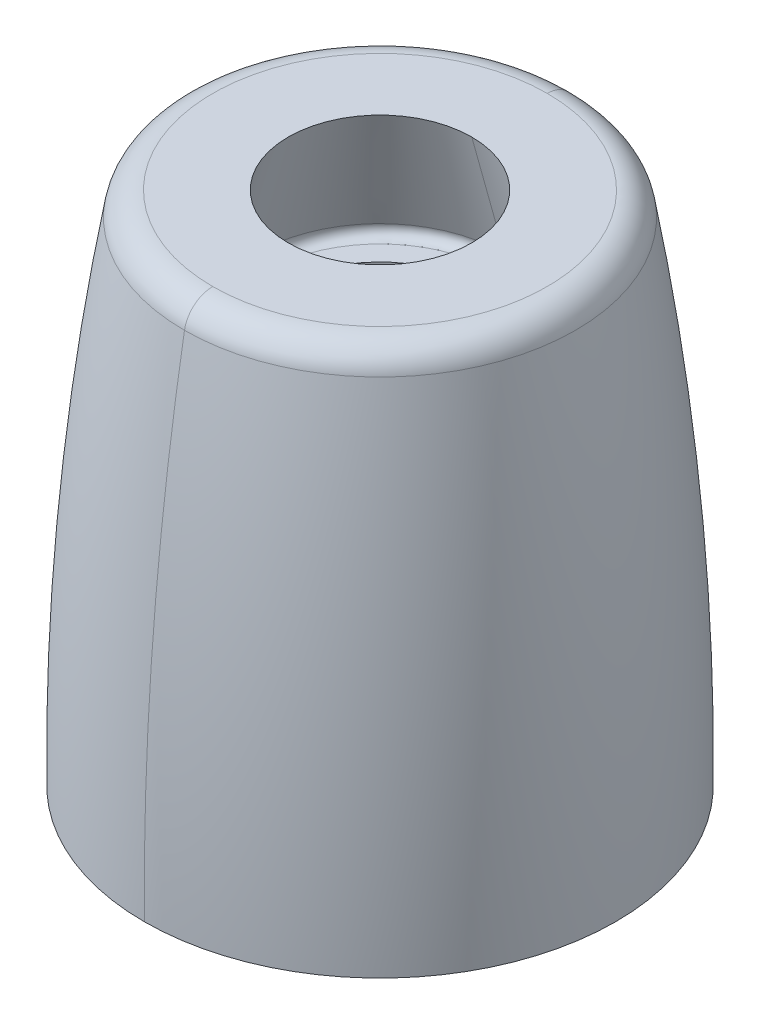
ISO-10303-21;
HEADER;
FILE_DESCRIPTION(('STEP AP214'),'2;1');
FILE_NAME('part.step','',(''),(''),'','','');
FILE_SCHEMA(('AUTOMOTIVE_DESIGN { 1 0 10303 214 1 1 1 1 }'));
ENDSEC;
DATA;
#1=APPLICATION_CONTEXT('core data for automotive mechanical design processes');
#2=APPLICATION_PROTOCOL_DEFINITION('international standard','automotive_design',2000,#1);
#3=PRODUCT_CONTEXT('',#1,'mechanical');
#4=PRODUCT('Part','Part','',(#3));
#5=PRODUCT_RELATED_PRODUCT_CATEGORY('part','',(#4));
#6=PRODUCT_DEFINITION_FORMATION('','',#4);
#7=PRODUCT_DEFINITION_CONTEXT('part definition',#1,'design');
#8=PRODUCT_DEFINITION('design','',#6,#7);
#9=PRODUCT_DEFINITION_SHAPE('','',#8);
#10=(LENGTH_UNIT() NAMED_UNIT(*) SI_UNIT(.MILLI.,.METRE.));
#11=(NAMED_UNIT(*) PLANE_ANGLE_UNIT() SI_UNIT($,.RADIAN.));
#12=(NAMED_UNIT(*) SI_UNIT($,.STERADIAN.) SOLID_ANGLE_UNIT());
#13=UNCERTAINTY_MEASURE_WITH_UNIT(LENGTH_MEASURE(1.E-05),#10,'distance_accuracy_value','');
#14=(GEOMETRIC_REPRESENTATION_CONTEXT(3) GLOBAL_UNCERTAINTY_ASSIGNED_CONTEXT((#13)) GLOBAL_UNIT_ASSIGNED_CONTEXT((#10,
#11,#12)) REPRESENTATION_CONTEXT('',''));
#15=CARTESIAN_POINT('',(0.,0.,0.));
#16=DIRECTION('',(0.,0.,1.));
#17=DIRECTION('',(1.,0.,0.));
#18=AXIS2_PLACEMENT_3D('',#15,#16,#17);
#19=CARTESIAN_POINT('',(0.,13.7602711168781,0.));
#20=DIRECTION('',(0.,-1.,0.));
#21=DIRECTION('',(0.,0.,-1.));
#22=AXIS2_PLACEMENT_3D('',#19,#20,#21);
#23=TOROIDAL_SURFACE('',#22,7.7536,2.);
#24=CARTESIAN_POINT('',(0.,15.7602711168781,0.));
#25=DIRECTION('',(0.,-1.,0.));
#26=DIRECTION('',(0.,0.,-1.));
#27=AXIS2_PLACEMENT_3D('',#24,#25,#26);
#28=CIRCLE('',#27,7.7536);
#29=CARTESIAN_POINT('',(0.,15.7602711168781,7.7536));
#30=VERTEX_POINT('',#29);
#31=CARTESIAN_POINT('',(0.,15.7602711168781,-7.7536));
#32=VERTEX_POINT('',#31);
#33=EDGE_CURVE('E49',#30,#32,#28,.T.);
#34=ORIENTED_EDGE('',*,*,#33,.F.);
#35=CARTESIAN_POINT('',(0.,13.7602711168781,7.7536));
#36=DIRECTION('',(1.,0.,0.));
#37=DIRECTION('',(0.,0.,-1.));
#38=AXIS2_PLACEMENT_3D('',#35,#36,#37);
#39=CIRCLE('',#38,2.);
#40=CARTESIAN_POINT('',(0.,13.7602711168781,9.7536));
#41=VERTEX_POINT('',#40);
#42=EDGE_CURVE('E13',#30,#41,#39,.T.);
#43=ORIENTED_EDGE('',*,*,#42,.T.);
#44=CARTESIAN_POINT('',(0.,13.7602711168781,0.));
#45=DIRECTION('',(0.,1.,0.));
#46=DIRECTION('',(0.,0.,-1.));
#47=AXIS2_PLACEMENT_3D('',#44,#45,#46);
#48=CIRCLE('',#47,9.7536);
#49=CARTESIAN_POINT('',(0.,13.7602711168781,-9.7536));
#50=VERTEX_POINT('',#49);
#51=EDGE_CURVE('E193',#50,#41,#48,.T.);
#52=ORIENTED_EDGE('',*,*,#51,.F.);
#53=CARTESIAN_POINT('',(0.,13.7602711168781,-7.7536));
#54=DIRECTION('',(-1.,0.,0.));
#55=DIRECTION('',(0.,0.,1.));
#56=AXIS2_PLACEMENT_3D('',#53,#54,#55);
#57=CIRCLE('',#56,2.);
#58=EDGE_CURVE('E144',#32,#50,#57,.T.);
#59=ORIENTED_EDGE('',*,*,#58,.F.);
#60=EDGE_LOOP('',(#34,#43,#52,#59));
#61=FACE_BOUND('',#60,.T.);
#62=ADVANCED_FACE('F24',(#61),#23,.F.);
#63=CARTESIAN_POINT('',(0.,24.8102710708781,0.));
#64=DIRECTION('',(0.,1.,0.));
#65=DIRECTION('',(0.,0.,1.));
#66=AXIS2_PLACEMENT_3D('',#63,#64,#65);
#67=TOROIDAL_SURFACE('',#66,6.40293581798289,0.5);
#68=CARTESIAN_POINT('',(0.,24.3102710708781,0.));
#69=DIRECTION('',(0.,1.,0.));
#70=DIRECTION('',(0.,0.,1.));
#71=AXIS2_PLACEMENT_3D('',#68,#69,#70);
#72=CIRCLE('',#71,6.40293581798289);
#73=CARTESIAN_POINT('',(0.,24.3102710708781,-6.40293581798289));
#74=VERTEX_POINT('',#73);
#75=CARTESIAN_POINT('',(0.,24.3102710708781,6.40293581798289));
#76=VERTEX_POINT('',#75);
#77=EDGE_CURVE('E134',#74,#76,#72,.T.);
#78=ORIENTED_EDGE('',*,*,#77,.F.);
#79=CARTESIAN_POINT('',(0.,24.8102710708781,-6.40293581798289));
#80=DIRECTION('',(1.,0.,0.));
#81=DIRECTION('',(0.,0.,-1.));
#82=AXIS2_PLACEMENT_3D('',#79,#80,#81);
#83=CIRCLE('',#82,0.5);
#84=CARTESIAN_POINT('',(0.,24.9444058474275,-6.88460776206937));
#85=VERTEX_POINT('',#84);
#86=EDGE_CURVE('E35',#74,#85,#83,.T.);
#87=ORIENTED_EDGE('',*,*,#86,.T.);
#88=CARTESIAN_POINT('',(0.,24.9444058474275,0.));
#89=DIRECTION('',(0.,-1.,0.));
#90=DIRECTION('',(0.,0.,-1.));
#91=AXIS2_PLACEMENT_3D('',#88,#89,#90);
#92=CIRCLE('',#91,6.88460776206937);
#93=CARTESIAN_POINT('',(0.,24.9444058474275,6.88460776206937));
#94=VERTEX_POINT('',#93);
#95=EDGE_CURVE('E137',#94,#85,#92,.T.);
#96=ORIENTED_EDGE('',*,*,#95,.F.);
#97=CARTESIAN_POINT('',(0.,24.8102710708781,6.40293581798289));
#98=DIRECTION('',(-1.,0.,0.));
#99=DIRECTION('',(0.,0.,1.));
#100=AXIS2_PLACEMENT_3D('',#97,#98,#99);
#101=CIRCLE('',#100,0.5);
#102=EDGE_CURVE('E130',#76,#94,#101,.T.);
#103=ORIENTED_EDGE('',*,*,#102,.F.);
#104=EDGE_LOOP('',(#78,#87,#96,#103));
#105=FACE_BOUND('',#104,.T.);
#106=ADVANCED_FACE('F132',(#105),#67,.F.);
#107=CARTESIAN_POINT('',(0.,29.8371710808781,0.));
#108=DIRECTION('',(0.,1.,0.));
#109=DIRECTION('',(0.,0.,1.));
#110=AXIS2_PLACEMENT_3D('',#107,#108,#109);
#111=TOROIDAL_SURFACE('',#110,9.26112285375294,1.5875);
#112=CARTESIAN_POINT('',(0.,30.1075682269507,0.));
#113=DIRECTION('',(0.,-1.,0.));
#114=DIRECTION('',(0.,0.,-1.));
#115=AXIS2_PLACEMENT_3D('',#112,#113,#114);
#116=CIRCLE('',#115,10.8254251370076);
#117=CARTESIAN_POINT('',(0.,30.1075682269507,-10.8254251370076));
#118=VERTEX_POINT('',#117);
#119=CARTESIAN_POINT('',(0.,30.1075682269507,10.8254251370076));
#120=VERTEX_POINT('',#119);
#121=EDGE_CURVE('E191',#118,#120,#116,.T.);
#122=ORIENTED_EDGE('',*,*,#121,.F.);
#123=CARTESIAN_POINT('',(0.,29.8371710808781,-9.26112285375294));
#124=DIRECTION('',(1.,0.,0.));
#125=DIRECTION('',(0.,0.,-1.));
#126=AXIS2_PLACEMENT_3D('',#123,#124,#125);
#127=CIRCLE('',#126,1.5875);
#128=CARTESIAN_POINT('',(0.,31.4246710808781,-9.26112285375294));
#129=VERTEX_POINT('',#128);
#130=EDGE_CURVE('E278',#118,#129,#127,.T.);
#131=ORIENTED_EDGE('',*,*,#130,.T.);
#132=CARTESIAN_POINT('',(0.,31.4246710808781,0.));
#133=DIRECTION('',(0.,1.,0.));
#134=DIRECTION('',(0.,0.,1.));
#135=AXIS2_PLACEMENT_3D('',#132,#133,#134);
#136=CIRCLE('',#135,9.26112285375294);
#137=CARTESIAN_POINT('',(0.,31.4246710808781,9.26112285375294));
#138=VERTEX_POINT('',#137);
#139=EDGE_CURVE('E219',#138,#129,#136,.T.);
#140=ORIENTED_EDGE('',*,*,#139,.F.);
#141=CARTESIAN_POINT('',(0.,29.8371710808781,9.26112285375294));
#142=DIRECTION('',(-1.,0.,0.));
#143=DIRECTION('',(0.,0.,1.));
#144=AXIS2_PLACEMENT_3D('',#141,#142,#143);
#145=CIRCLE('',#144,1.5875);
#146=EDGE_CURVE('E143',#120,#138,#145,.T.);
#147=ORIENTED_EDGE('',*,*,#146,.F.);
#148=EDGE_LOOP('',(#122,#131,#140,#147));
#149=FACE_BOUND('',#148,.T.);
#150=ADVANCED_FACE('F316',(#149),#111,.T.);
#151=CARTESIAN_POINT('',(0.,31.4246710808781,0.));
#152=DIRECTION('',(0.,-1.,0.));
#153=DIRECTION('',(0.,0.,-1.));
#154=AXIS2_PLACEMENT_3D('',#151,#152,#153);
#155=CONICAL_SURFACE('',#154,5.08,0.271596289017785);
#156=CARTESIAN_POINT('',(0.,31.4246710808781,0.));
#157=DIRECTION('',(0.,-1.,0.));
#158=DIRECTION('',(0.,0.,-1.));
#159=AXIS2_PLACEMENT_3D('',#156,#157,#158);
#160=CIRCLE('',#159,5.08);
#161=CARTESIAN_POINT('',(0.,31.4246710808781,5.08));
#162=VERTEX_POINT('',#161);
#163=CARTESIAN_POINT('',(0.,31.4246710808781,-5.08));
#164=VERTEX_POINT('',#163);
#165=EDGE_CURVE('E173',#162,#164,#160,.T.);
#166=ORIENTED_EDGE('',*,*,#165,.F.);
#167=DIRECTION('',(0.,-0.963343888172967,0.268269553098728));
#168=VECTOR('',#167,1.);
#169=CARTESIAN_POINT('',(0.,31.4246710808781,5.08));
#170=LINE('',#169,#168);
#171=EDGE_CURVE('E28',#162,#94,#170,.T.);
#172=ORIENTED_EDGE('',*,*,#171,.T.);
#173=ORIENTED_EDGE('',*,*,#95,.T.);
#174=DIRECTION('',(0.,-0.963343888172967,-0.268269553098728));
#175=VECTOR('',#174,1.);
#176=CARTESIAN_POINT('',(0.,31.4246710808781,-5.08));
#177=LINE('',#176,#175);
#178=EDGE_CURVE('E218',#164,#85,#177,.T.);
#179=ORIENTED_EDGE('',*,*,#178,.F.);
#180=EDGE_LOOP('',(#166,#172,#173,#179));
#181=FACE_BOUND('',#180,.T.);
#182=ADVANCED_FACE('F295',(#181),#155,.F.);
#183=CARTESIAN_POINT('',(0.,31.0037578537676,0.));
#184=DIRECTION('',(0.,-1.,0.));
#185=DIRECTION('',(0.,0.,-1.));
#186=AXIS2_PLACEMENT_3D('',#183,#184,#185);
#187=CYLINDRICAL_SURFACE('',#186,5.18);
#188=CARTESIAN_POINT('',(0.,24.3102710708781,0.));
#189=DIRECTION('',(0.,-1.,0.));
#190=DIRECTION('',(0.,0.,-1.));
#191=AXIS2_PLACEMENT_3D('',#188,#189,#190);
#192=CIRCLE('',#191,5.18);
#193=CARTESIAN_POINT('',(0.,24.3102710708781,5.18));
#194=VERTEX_POINT('',#193);
#195=CARTESIAN_POINT('',(0.,24.3102710708781,-5.18));
#196=VERTEX_POINT('',#195);
#197=EDGE_CURVE('E225',#194,#196,#192,.T.);
#198=ORIENTED_EDGE('',*,*,#197,.F.);
#199=DIRECTION('',(0.,-1.,0.));
#200=VECTOR('',#199,1.);
#201=CARTESIAN_POINT('',(0.,31.0037578537676,5.18));
#202=LINE('',#201,#200);
#203=CARTESIAN_POINT('',(0.,15.7602711168781,5.18));
#204=VERTEX_POINT('',#203);
#205=EDGE_CURVE('E177',#194,#204,#202,.T.);
#206=ORIENTED_EDGE('',*,*,#205,.T.);
#207=CARTESIAN_POINT('',(0.,15.7602711168781,0.));
#208=DIRECTION('',(0.,-1.,0.));
#209=DIRECTION('',(0.,0.,-1.));
#210=AXIS2_PLACEMENT_3D('',#207,#208,#209);
#211=CIRCLE('',#210,5.18);
#212=CARTESIAN_POINT('',(0.,15.7602711168781,-5.18));
#213=VERTEX_POINT('',#212);
#214=EDGE_CURVE('E181',#204,#213,#211,.T.);
#215=ORIENTED_EDGE('',*,*,#214,.T.);
#216=DIRECTION('',(0.,-1.,0.));
#217=VECTOR('',#216,1.);
#218=CARTESIAN_POINT('',(0.,31.0037578537676,-5.18));
#219=LINE('',#218,#217);
#220=EDGE_CURVE('E164',#196,#213,#219,.T.);
#221=ORIENTED_EDGE('',*,*,#220,.F.);
#222=EDGE_LOOP('',(#198,#206,#215,#221));
#223=FACE_BOUND('',#222,.T.);
#224=ADVANCED_FACE('F336',(#223),#187,.F.);
#225=CARTESIAN_POINT('',(0.,31.0037578537676,0.));
#226=DIRECTION('',(0.,-1.,0.));
#227=DIRECTION('',(0.,0.,-1.));
#228=AXIS2_PLACEMENT_3D('',#225,#226,#227);
#229=CYLINDRICAL_SURFACE('',#228,9.7536);
#230=ORIENTED_EDGE('',*,*,#51,.T.);
#231=DIRECTION('',(0.,-1.,0.));
#232=VECTOR('',#231,1.);
#233=CARTESIAN_POINT('',(0.,31.0037578537676,9.7536));
#234=LINE('',#233,#232);
#235=CARTESIAN_POINT('',(0.,2.86027108087809,9.7536));
#236=VERTEX_POINT('',#235);
#237=EDGE_CURVE('E197',#41,#236,#234,.T.);
#238=ORIENTED_EDGE('',*,*,#237,.T.);
#239=CARTESIAN_POINT('',(0.,2.86027108087809,0.));
#240=DIRECTION('',(0.,-1.,0.));
#241=DIRECTION('',(0.,0.,-1.));
#242=AXIS2_PLACEMENT_3D('',#239,#240,#241);
#243=CIRCLE('',#242,9.7536);
#244=CARTESIAN_POINT('',(0.,2.86027108087809,-9.7536));
#245=VERTEX_POINT('',#244);
#246=EDGE_CURVE('E211',#236,#245,#243,.T.);
#247=ORIENTED_EDGE('',*,*,#246,.T.);
#248=DIRECTION('',(0.,-1.,0.));
#249=VECTOR('',#248,1.);
#250=CARTESIAN_POINT('',(0.,31.0037578537676,-9.7536));
#251=LINE('',#250,#249);
#252=EDGE_CURVE('E205',#50,#245,#251,.T.);
#253=ORIENTED_EDGE('',*,*,#252,.F.);
#254=EDGE_LOOP('',(#230,#238,#247,#253));
#255=FACE_BOUND('',#254,.T.);
#256=ADVANCED_FACE('F333',(#255),#229,.F.);
#257=CARTESIAN_POINT('',(0.,4.14944220398614,0.));
#258=DIRECTION('',(0.,-1.,0.));
#259=DIRECTION('',(0.,0.,1.));
#260=AXIS2_PLACEMENT_3D('',#257,#258,#259);
#261=DEGENERATE_TOROIDAL_SURFACE('',#260,139.347594055442,152.4,.F.);
#262=ORIENTED_EDGE('',*,*,#121,.T.);
#263=CARTESIAN_POINT('',(0.,4.14944220398614,-139.347594055442));
#264=DIRECTION('',(1.,0.,0.));
#265=DIRECTION('',(0.,0.,-1.));
#266=AXIS2_PLACEMENT_3D('',#263,#264,#265);
#267=CIRCLE('',#266,152.4);
#268=CARTESIAN_POINT('',(0.,2.86027108087809,13.0469532151716));
#269=VERTEX_POINT('',#268);
#270=EDGE_CURVE('E187',#120,#269,#267,.T.);
#271=ORIENTED_EDGE('',*,*,#270,.T.);
#272=CARTESIAN_POINT('',(0.,2.86027108087809,0.));
#273=DIRECTION('',(0.,-1.,0.));
#274=DIRECTION('',(0.,0.,-1.));
#275=AXIS2_PLACEMENT_3D('',#272,#273,#274);
#276=CIRCLE('',#275,13.0469532151717);
#277=CARTESIAN_POINT('',(0.,2.86027108087809,-13.0469532151716));
#278=VERTEX_POINT('',#277);
#279=EDGE_CURVE('E243',#278,#269,#276,.T.);
#280=ORIENTED_EDGE('',*,*,#279,.F.);
#281=CARTESIAN_POINT('',(0.,4.14944220398614,139.347594055442));
#282=DIRECTION('',(-1.,0.,0.));
#283=DIRECTION('',(0.,0.,1.));
#284=AXIS2_PLACEMENT_3D('',#281,#282,#283);
#285=CIRCLE('',#284,152.4);
#286=EDGE_CURVE('E246',#118,#278,#285,.T.);
#287=ORIENTED_EDGE('',*,*,#286,.F.);
#288=EDGE_LOOP('',(#262,#271,#280,#287));
#289=FACE_BOUND('',#288,.T.);
#290=ADVANCED_FACE('F335',(#289),#261,.F.);
#291=CARTESIAN_POINT('',(0.,4.14944220398614,0.));
#292=DIRECTION('',(0.,-1.,0.));
#293=DIRECTION('',(0.,0.,1.));
#294=AXIS2_PLACEMENT_3D('',#291,#292,#293);
#295=DEGENERATE_TOROIDAL_SURFACE('',#294,139.347594055442,152.4,.F.);
#296=ORIENTED_EDGE('',*,*,#270,.F.);
#297=CARTESIAN_POINT('',(0.,30.1075682269507,0.));
#298=DIRECTION('',(0.,-1.,0.));
#299=DIRECTION('',(0.,0.,-1.));
#300=AXIS2_PLACEMENT_3D('',#297,#298,#299);
#301=CIRCLE('',#300,10.8254251370076);
#302=EDGE_CURVE('E192',#120,#118,#301,.T.);
#303=ORIENTED_EDGE('',*,*,#302,.T.);
#304=ORIENTED_EDGE('',*,*,#286,.T.);
#305=CARTESIAN_POINT('',(0.,2.86027108087809,0.));
#306=DIRECTION('',(0.,-1.,0.));
#307=DIRECTION('',(0.,0.,-1.));
#308=AXIS2_PLACEMENT_3D('',#305,#306,#307);
#309=CIRCLE('',#308,13.0469532151717);
#310=EDGE_CURVE('E204',#269,#278,#309,.T.);
#311=ORIENTED_EDGE('',*,*,#310,.F.);
#312=EDGE_LOOP('',(#296,#303,#304,#311));
#313=FACE_BOUND('',#312,.T.);
#314=ADVANCED_FACE('F268',(#313),#295,.F.);
#315=CARTESIAN_POINT('',(9.7536,2.86027108087809,0.));
#316=DIRECTION('',(0.,-1.,0.));
#317=DIRECTION('',(0.,0.,-1.));
#318=AXIS2_PLACEMENT_3D('',#315,#316,#317);
#319=PLANE('',#318);
#320=ORIENTED_EDGE('',*,*,#279,.T.);
#321=ORIENTED_EDGE('',*,*,#310,.T.);
#322=EDGE_LOOP('',(#320,#321));
#323=FACE_BOUND('',#322,.T.);
#324=CARTESIAN_POINT('',(0.,2.86027108087809,0.));
#325=DIRECTION('',(0.,-1.,0.));
#326=DIRECTION('',(0.,0.,-1.));
#327=AXIS2_PLACEMENT_3D('',#324,#325,#326);
#328=CIRCLE('',#327,9.7536);
#329=EDGE_CURVE('E171',#245,#236,#328,.T.);
#330=ORIENTED_EDGE('',*,*,#329,.F.);
#331=ORIENTED_EDGE('',*,*,#246,.F.);
#332=EDGE_LOOP('',(#330,#331));
#333=FACE_BOUND('',#332,.T.);
#334=ADVANCED_FACE('F262',(#323,#333),#319,.T.);
#335=CARTESIAN_POINT('',(0.,31.0037578537676,0.));
#336=DIRECTION('',(0.,-1.,0.));
#337=DIRECTION('',(0.,0.,-1.));
#338=AXIS2_PLACEMENT_3D('',#335,#336,#337);
#339=CYLINDRICAL_SURFACE('',#338,9.7536);
#340=ORIENTED_EDGE('',*,*,#237,.F.);
#341=CARTESIAN_POINT('',(0.,13.7602711168781,0.));
#342=DIRECTION('',(0.,1.,0.));
#343=DIRECTION('',(0.,0.,-1.));
#344=AXIS2_PLACEMENT_3D('',#341,#342,#343);
#345=CIRCLE('',#344,9.7536);
#346=EDGE_CURVE('E200',#41,#50,#345,.T.);
#347=ORIENTED_EDGE('',*,*,#346,.T.);
#348=ORIENTED_EDGE('',*,*,#252,.T.);
#349=ORIENTED_EDGE('',*,*,#329,.T.);
#350=EDGE_LOOP('',(#340,#347,#348,#349));
#351=FACE_BOUND('',#350,.T.);
#352=ADVANCED_FACE('F319',(#351),#339,.F.);
#353=CARTESIAN_POINT('',(9.7536,15.7602711168781,0.));
#354=DIRECTION('',(0.,-1.,0.));
#355=DIRECTION('',(0.,0.,-1.));
#356=AXIS2_PLACEMENT_3D('',#353,#354,#355);
#357=PLANE('',#356);
#358=CARTESIAN_POINT('',(0.,15.7602711168781,0.));
#359=DIRECTION('',(0.,-1.,0.));
#360=DIRECTION('',(0.,0.,-1.));
#361=AXIS2_PLACEMENT_3D('',#358,#359,#360);
#362=CIRCLE('',#361,7.7536);
#363=EDGE_CURVE('E169',#32,#30,#362,.T.);
#364=ORIENTED_EDGE('',*,*,#363,.T.);
#365=ORIENTED_EDGE('',*,*,#33,.T.);
#366=EDGE_LOOP('',(#364,#365));
#367=FACE_BOUND('',#366,.T.);
#368=CARTESIAN_POINT('',(0.,15.7602711168781,0.));
#369=DIRECTION('',(0.,-1.,0.));
#370=DIRECTION('',(0.,0.,-1.));
#371=AXIS2_PLACEMENT_3D('',#368,#369,#370);
#372=CIRCLE('',#371,5.18);
#373=EDGE_CURVE('E156',#213,#204,#372,.T.);
#374=ORIENTED_EDGE('',*,*,#373,.F.);
#375=ORIENTED_EDGE('',*,*,#214,.F.);
#376=EDGE_LOOP('',(#374,#375));
#377=FACE_BOUND('',#376,.T.);
#378=ADVANCED_FACE('F322',(#367,#377),#357,.T.);
#379=CARTESIAN_POINT('',(0.,31.0037578537676,0.));
#380=DIRECTION('',(0.,-1.,0.));
#381=DIRECTION('',(0.,0.,-1.));
#382=AXIS2_PLACEMENT_3D('',#379,#380,#381);
#383=CYLINDRICAL_SURFACE('',#382,5.18);
#384=ORIENTED_EDGE('',*,*,#205,.F.);
#385=CARTESIAN_POINT('',(0.,24.3102710708781,0.));
#386=DIRECTION('',(0.,-1.,0.));
#387=DIRECTION('',(0.,0.,-1.));
#388=AXIS2_PLACEMENT_3D('',#385,#386,#387);
#389=CIRCLE('',#388,5.18);
#390=EDGE_CURVE('E152',#196,#194,#389,.T.);
#391=ORIENTED_EDGE('',*,*,#390,.F.);
#392=ORIENTED_EDGE('',*,*,#220,.T.);
#393=ORIENTED_EDGE('',*,*,#373,.T.);
#394=EDGE_LOOP('',(#384,#391,#392,#393));
#395=FACE_BOUND('',#394,.T.);
#396=ADVANCED_FACE('F328',(#395),#383,.F.);
#397=CARTESIAN_POINT('',(5.18,24.3102710708781,0.));
#398=DIRECTION('',(0.,1.,0.));
#399=DIRECTION('',(1.,0.,0.));
#400=AXIS2_PLACEMENT_3D('',#397,#398,#399);
#401=PLANE('',#400);
#402=CARTESIAN_POINT('',(0.,24.3102710708781,0.));
#403=DIRECTION('',(0.,1.,0.));
#404=DIRECTION('',(0.,0.,1.));
#405=AXIS2_PLACEMENT_3D('',#402,#403,#404);
#406=CIRCLE('',#405,6.40293581798289);
#407=EDGE_CURVE('E150',#76,#74,#406,.T.);
#408=ORIENTED_EDGE('',*,*,#407,.T.);
#409=ORIENTED_EDGE('',*,*,#77,.T.);
#410=EDGE_LOOP('',(#408,#409));
#411=FACE_BOUND('',#410,.T.);
#412=ORIENTED_EDGE('',*,*,#390,.T.);
#413=ORIENTED_EDGE('',*,*,#197,.T.);
#414=EDGE_LOOP('',(#412,#413));
#415=FACE_BOUND('',#414,.T.);
#416=ADVANCED_FACE('F148',(#411,#415),#401,.T.);
#417=CARTESIAN_POINT('',(0.,31.4246710808781,0.));
#418=DIRECTION('',(0.,-1.,0.));
#419=DIRECTION('',(0.,0.,-1.));
#420=AXIS2_PLACEMENT_3D('',#417,#418,#419);
#421=CONICAL_SURFACE('',#420,5.08,0.271596289017785);
#422=ORIENTED_EDGE('',*,*,#171,.F.);
#423=CARTESIAN_POINT('',(0.,31.4246710808781,0.));
#424=DIRECTION('',(0.,-1.,0.));
#425=DIRECTION('',(0.,0.,-1.));
#426=AXIS2_PLACEMENT_3D('',#423,#424,#425);
#427=CIRCLE('',#426,5.08);
#428=EDGE_CURVE('E176',#164,#162,#427,.T.);
#429=ORIENTED_EDGE('',*,*,#428,.F.);
#430=ORIENTED_EDGE('',*,*,#178,.T.);
#431=CARTESIAN_POINT('',(0.,24.9444058474275,0.));
#432=DIRECTION('',(0.,-1.,0.));
#433=DIRECTION('',(0.,0.,-1.));
#434=AXIS2_PLACEMENT_3D('',#431,#432,#433);
#435=CIRCLE('',#434,6.88460776206937);
#436=EDGE_CURVE('E214',#85,#94,#435,.T.);
#437=ORIENTED_EDGE('',*,*,#436,.T.);
#438=EDGE_LOOP('',(#422,#429,#430,#437));
#439=FACE_BOUND('',#438,.T.);
#440=ADVANCED_FACE('F299',(#439),#421,.F.);
#441=CARTESIAN_POINT('',(5.08,31.4246710808781,0.));
#442=DIRECTION('',(0.,1.,0.));
#443=DIRECTION('',(1.,0.,0.));
#444=AXIS2_PLACEMENT_3D('',#441,#442,#443);
#445=PLANE('',#444);
#446=ORIENTED_EDGE('',*,*,#139,.T.);
#447=CARTESIAN_POINT('',(0.,31.4246710808781,0.));
#448=DIRECTION('',(0.,1.,0.));
#449=DIRECTION('',(0.,0.,1.));
#450=AXIS2_PLACEMENT_3D('',#447,#448,#449);
#451=CIRCLE('',#450,9.26112285375294);
#452=EDGE_CURVE('E168',#129,#138,#451,.T.);
#453=ORIENTED_EDGE('',*,*,#452,.T.);
#454=EDGE_LOOP('',(#446,#453));
#455=FACE_BOUND('',#454,.T.);
#456=ORIENTED_EDGE('',*,*,#428,.T.);
#457=ORIENTED_EDGE('',*,*,#165,.T.);
#458=EDGE_LOOP('',(#456,#457));
#459=FACE_BOUND('',#458,.T.);
#460=ADVANCED_FACE('F26',(#455,#459),#445,.T.);
#461=CARTESIAN_POINT('',(0.,29.8371710808781,0.));
#462=DIRECTION('',(0.,1.,0.));
#463=DIRECTION('',(0.,0.,1.));
#464=AXIS2_PLACEMENT_3D('',#461,#462,#463);
#465=TOROIDAL_SURFACE('',#464,9.26112285375294,1.5875);
#466=ORIENTED_EDGE('',*,*,#130,.F.);
#467=ORIENTED_EDGE('',*,*,#302,.F.);
#468=ORIENTED_EDGE('',*,*,#146,.T.);
#469=ORIENTED_EDGE('',*,*,#452,.F.);
#470=EDGE_LOOP('',(#466,#467,#468,#469));
#471=FACE_BOUND('',#470,.T.);
#472=ADVANCED_FACE('F302',(#471),#465,.T.);
#473=CARTESIAN_POINT('',(0.,24.8102710708781,0.));
#474=DIRECTION('',(0.,1.,0.));
#475=DIRECTION('',(0.,0.,1.));
#476=AXIS2_PLACEMENT_3D('',#473,#474,#475);
#477=TOROIDAL_SURFACE('',#476,6.40293581798289,0.5);
#478=ORIENTED_EDGE('',*,*,#86,.F.);
#479=ORIENTED_EDGE('',*,*,#407,.F.);
#480=ORIENTED_EDGE('',*,*,#102,.T.);
#481=ORIENTED_EDGE('',*,*,#436,.F.);
#482=EDGE_LOOP('',(#478,#479,#480,#481));
#483=FACE_BOUND('',#482,.T.);
#484=ADVANCED_FACE('F154',(#483),#477,.F.);
#485=CARTESIAN_POINT('',(0.,13.7602711168781,0.));
#486=DIRECTION('',(0.,-1.,0.));
#487=DIRECTION('',(0.,0.,-1.));
#488=AXIS2_PLACEMENT_3D('',#485,#486,#487);
#489=TOROIDAL_SURFACE('',#488,7.7536,2.);
#490=ORIENTED_EDGE('',*,*,#42,.F.);
#491=ORIENTED_EDGE('',*,*,#363,.F.);
#492=ORIENTED_EDGE('',*,*,#58,.T.);
#493=ORIENTED_EDGE('',*,*,#346,.F.);
#494=EDGE_LOOP('',(#490,#491,#492,#493));
#495=FACE_BOUND('',#494,.T.);
#496=ADVANCED_FACE('F332',(#495),#489,.F.);
#497=CLOSED_SHELL('',(#62,#106,#150,#182,#224,#256,#290,#314,#334,#352,#378,#396,#416,#440,#460,
#472,#484,#496));
#498=MANIFOLD_SOLID_BREP('B1',#497);
#499=ADVANCED_BREP_SHAPE_REPRESENTATION('',(#18,#498),#14);
#500=SHAPE_DEFINITION_REPRESENTATION(#9,#499);
ENDSEC;
END-ISO-10303-21;
